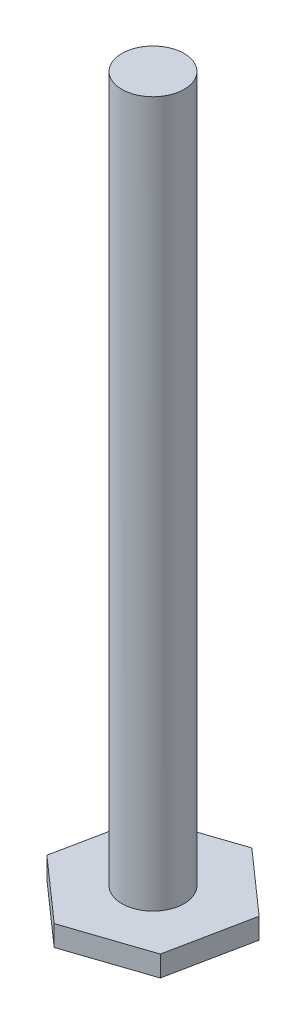
ISO-10303-21;
HEADER;
FILE_DESCRIPTION(('STEP AP214'),'2;1');
FILE_NAME('part.step','',(''),(''),'','','');
FILE_SCHEMA(('AUTOMOTIVE_DESIGN { 1 0 10303 214 1 1 1 1 }'));
ENDSEC;
DATA;
#1=APPLICATION_CONTEXT('core data for automotive mechanical design processes');
#2=APPLICATION_PROTOCOL_DEFINITION('international standard','automotive_design',2000,#1);
#3=PRODUCT_CONTEXT('',#1,'mechanical');
#4=PRODUCT('Part','Part','',(#3));
#5=PRODUCT_RELATED_PRODUCT_CATEGORY('part','',(#4));
#6=PRODUCT_DEFINITION_FORMATION('','',#4);
#7=PRODUCT_DEFINITION_CONTEXT('part definition',#1,'design');
#8=PRODUCT_DEFINITION('design','',#6,#7);
#9=PRODUCT_DEFINITION_SHAPE('','',#8);
#10=(LENGTH_UNIT() NAMED_UNIT(*) SI_UNIT(.MILLI.,.METRE.));
#11=(NAMED_UNIT(*) PLANE_ANGLE_UNIT() SI_UNIT($,.RADIAN.));
#12=(NAMED_UNIT(*) SI_UNIT($,.STERADIAN.) SOLID_ANGLE_UNIT());
#13=UNCERTAINTY_MEASURE_WITH_UNIT(LENGTH_MEASURE(1.E-05),#10,'distance_accuracy_value','');
#14=(GEOMETRIC_REPRESENTATION_CONTEXT(3) GLOBAL_UNCERTAINTY_ASSIGNED_CONTEXT((#13)) GLOBAL_UNIT_ASSIGNED_CONTEXT((#10,
#11,#12)) REPRESENTATION_CONTEXT('',''));
#15=CARTESIAN_POINT('',(0.,0.,0.));
#16=DIRECTION('',(0.,0.,1.));
#17=DIRECTION('',(1.,0.,0.));
#18=AXIS2_PLACEMENT_3D('',#15,#16,#17);
#19=CARTESIAN_POINT('',(0.,35.,0.));
#20=DIRECTION('',(0.,1.,0.));
#21=DIRECTION('',(0.,0.,1.));
#22=AXIS2_PLACEMENT_3D('',#19,#20,#21);
#23=PLANE('',#22);
#24=CARTESIAN_POINT('',(0.,35.,0.));
#25=DIRECTION('',(0.,-1.,0.));
#26=DIRECTION('',(0.,0.,-1.));
#27=AXIS2_PLACEMENT_3D('',#24,#25,#26);
#28=CIRCLE('',#27,1.5);
#29=CARTESIAN_POINT('',(0.,35.,-1.5));
#30=VERTEX_POINT('',#29);
#31=EDGE_CURVE('E44',#30,#30,#28,.T.);
#32=ORIENTED_EDGE('',*,*,#31,.F.);
#33=EDGE_LOOP('',(#32));
#34=FACE_BOUND('',#33,.T.);
#35=ADVANCED_FACE('F36',(#34),#23,.T.);
#36=CARTESIAN_POINT('',(0.,0.,0.));
#37=DIRECTION('',(0.,-1.,0.));
#38=DIRECTION('',(0.,0.,-1.));
#39=AXIS2_PLACEMENT_3D('',#36,#37,#38);
#40=CYLINDRICAL_SURFACE('',#39,1.5);
#41=CARTESIAN_POINT('',(0.,1.,0.));
#42=DIRECTION('',(0.,1.,0.));
#43=DIRECTION('',(0.,0.,1.));
#44=AXIS2_PLACEMENT_3D('',#41,#42,#43);
#45=CIRCLE('',#44,1.5);
#46=CARTESIAN_POINT('',(0.,1.,1.5));
#47=VERTEX_POINT('',#46);
#48=EDGE_CURVE('E11',#47,#47,#45,.F.);
#49=ORIENTED_EDGE('',*,*,#48,.F.);
#50=EDGE_LOOP('',(#49));
#51=FACE_BOUND('',#50,.T.);
#52=ORIENTED_EDGE('',*,*,#31,.T.);
#53=EDGE_LOOP('',(#52));
#54=FACE_BOUND('',#53,.T.);
#55=ADVANCED_FACE('F142',(#51,#54),#40,.T.);
#56=CARTESIAN_POINT('',(3.02872304898075,1.,2.67584940269554));
#57=DIRECTION('',(-0.980062590415269,0.,-0.198689000371217));
#58=DIRECTION('',(-0.198689000371217,0.,0.980062590415269));
#59=AXIS2_PLACEMENT_3D('',#56,#57,#58);
#60=PLANE('',#59);
#61=DIRECTION('',(0.198689000371217,0.,-0.980062590415269));
#62=VECTOR('',#61,1.);
#63=CARTESIAN_POINT('',(3.02872304898075,0.,2.67584940269554));
#64=LINE('',#63,#62);
#65=CARTESIAN_POINT('',(3.02872304898075,0.,2.67584940269554));
#66=VERTEX_POINT('',#65);
#67=CARTESIAN_POINT('',(3.83171508392613,0.,-1.28502640009702));
#68=VERTEX_POINT('',#67);
#69=EDGE_CURVE('E121',#66,#68,#64,.T.);
#70=ORIENTED_EDGE('',*,*,#69,.T.);
#71=DIRECTION('',(0.,-1.,0.));
#72=VECTOR('',#71,1.);
#73=CARTESIAN_POINT('',(3.83171508392613,1.,-1.28502640009702));
#74=LINE('',#73,#72);
#75=CARTESIAN_POINT('',(3.83171508392613,1.,-1.28502640009702));
#76=VERTEX_POINT('',#75);
#77=EDGE_CURVE('E138',#76,#68,#74,.T.);
#78=ORIENTED_EDGE('',*,*,#77,.F.);
#79=DIRECTION('',(0.198689000371217,0.,-0.980062590415269));
#80=VECTOR('',#79,1.);
#81=CARTESIAN_POINT('',(3.02872304898075,1.,2.67584940269554));
#82=LINE('',#81,#80);
#83=CARTESIAN_POINT('',(3.02872304898075,1.,2.67584940269554));
#84=VERTEX_POINT('',#83);
#85=EDGE_CURVE('E131',#84,#76,#82,.T.);
#86=ORIENTED_EDGE('',*,*,#85,.F.);
#87=DIRECTION('',(0.,-1.,0.));
#88=VECTOR('',#87,1.);
#89=CARTESIAN_POINT('',(3.02872304898075,1.,2.67584940269554));
#90=LINE('',#89,#88);
#91=EDGE_CURVE('E117',#84,#66,#90,.T.);
#92=ORIENTED_EDGE('',*,*,#91,.T.);
#93=EDGE_LOOP('',(#70,#78,#86,#92));
#94=FACE_BOUND('',#93,.T.);
#95=ADVANCED_FACE('F148',(#94),#60,.F.);
#96=CARTESIAN_POINT('',(3.83171508392613,1.,-1.28502640009702));
#97=DIRECTION('',(-0.662101016981644,0.,0.749414600412798));
#98=DIRECTION('',(0.749414600412798,0.,0.662101016981644));
#99=AXIS2_PLACEMENT_3D('',#96,#97,#98);
#100=PLANE('',#99);
#101=DIRECTION('',(-0.749414600412798,0.,-0.662101016981644));
#102=VECTOR('',#101,1.);
#103=CARTESIAN_POINT('',(3.83171508392613,0.,-1.28502640009702));
#104=LINE('',#103,#102);
#105=CARTESIAN_POINT('',(0.802992034945378,0.,-3.96087580279256));
#106=VERTEX_POINT('',#105);
#107=EDGE_CURVE('E124',#68,#106,#104,.T.);
#108=ORIENTED_EDGE('',*,*,#107,.T.);
#109=DIRECTION('',(0.,-1.,0.));
#110=VECTOR('',#109,1.);
#111=CARTESIAN_POINT('',(0.802992034945378,1.,-3.96087580279256));
#112=LINE('',#111,#110);
#113=CARTESIAN_POINT('',(0.802992034945378,1.,-3.96087580279256));
#114=VERTEX_POINT('',#113);
#115=EDGE_CURVE('E135',#114,#106,#112,.T.);
#116=ORIENTED_EDGE('',*,*,#115,.F.);
#117=DIRECTION('',(-0.749414600412798,0.,-0.662101016981644));
#118=VECTOR('',#117,1.);
#119=CARTESIAN_POINT('',(3.83171508392613,1.,-1.28502640009702));
#120=LINE('',#119,#118);
#121=EDGE_CURVE('E90',#76,#114,#120,.T.);
#122=ORIENTED_EDGE('',*,*,#121,.F.);
#123=ORIENTED_EDGE('',*,*,#77,.T.);
#124=EDGE_LOOP('',(#108,#116,#122,#123));
#125=FACE_BOUND('',#124,.T.);
#126=ADVANCED_FACE('F153',(#125),#100,.F.);
#127=CARTESIAN_POINT('',(0.802992034945378,1.,-3.96087580279256));
#128=DIRECTION('',(0.317961573433625,0.,0.948103600784014));
#129=DIRECTION('',(0.948103600784014,0.,-0.317961573433625));
#130=AXIS2_PLACEMENT_3D('',#127,#128,#129);
#131=PLANE('',#130);
#132=DIRECTION('',(-0.948103600784014,0.,0.317961573433625));
#133=VECTOR('',#132,1.);
#134=CARTESIAN_POINT('',(0.802992034945378,0.,-3.96087580279256));
#135=LINE('',#134,#133);
#136=CARTESIAN_POINT('',(-3.02872304898075,0.,-2.67584940269554));
#137=VERTEX_POINT('',#136);
#138=EDGE_CURVE('E126',#106,#137,#135,.T.);
#139=ORIENTED_EDGE('',*,*,#138,.T.);
#140=DIRECTION('',(0.,-1.,0.));
#141=VECTOR('',#140,1.);
#142=CARTESIAN_POINT('',(-3.02872304898075,1.,-2.67584940269554));
#143=LINE('',#142,#141);
#144=CARTESIAN_POINT('',(-3.02872304898075,1.,-2.67584940269554));
#145=VERTEX_POINT('',#144);
#146=EDGE_CURVE('E112',#145,#137,#143,.T.);
#147=ORIENTED_EDGE('',*,*,#146,.F.);
#148=DIRECTION('',(-0.948103600784014,0.,0.317961573433625));
#149=VECTOR('',#148,1.);
#150=CARTESIAN_POINT('',(0.802992034945378,1.,-3.96087580279256));
#151=LINE('',#150,#149);
#152=EDGE_CURVE('E103',#114,#145,#151,.T.);
#153=ORIENTED_EDGE('',*,*,#152,.F.);
#154=ORIENTED_EDGE('',*,*,#115,.T.);
#155=EDGE_LOOP('',(#139,#147,#153,#154));
#156=FACE_BOUND('',#155,.T.);
#157=ADVANCED_FACE('F164',(#156),#131,.F.);
#158=CARTESIAN_POINT('',(-3.02872304898075,1.,-2.67584940269554));
#159=DIRECTION('',(0.980062590415269,0.,0.198689000371217));
#160=DIRECTION('',(0.198689000371217,0.,-0.980062590415269));
#161=AXIS2_PLACEMENT_3D('',#158,#159,#160);
#162=PLANE('',#161);
#163=DIRECTION('',(-0.198689000371217,0.,0.980062590415269));
#164=VECTOR('',#163,1.);
#165=CARTESIAN_POINT('',(-3.02872304898075,0.,-2.67584940269554));
#166=LINE('',#165,#164);
#167=CARTESIAN_POINT('',(-3.83171508392613,0.,1.28502640009702));
#168=VERTEX_POINT('',#167);
#169=EDGE_CURVE('E111',#137,#168,#166,.T.);
#170=ORIENTED_EDGE('',*,*,#169,.T.);
#171=DIRECTION('',(0.,-1.,0.));
#172=VECTOR('',#171,1.);
#173=CARTESIAN_POINT('',(-3.83171508392613,1.,1.28502640009702));
#174=LINE('',#173,#172);
#175=CARTESIAN_POINT('',(-3.83171508392613,1.,1.28502640009702));
#176=VERTEX_POINT('',#175);
#177=EDGE_CURVE('E108',#176,#168,#174,.T.);
#178=ORIENTED_EDGE('',*,*,#177,.F.);
#179=DIRECTION('',(-0.198689000371217,0.,0.980062590415269));
#180=VECTOR('',#179,1.);
#181=CARTESIAN_POINT('',(-3.02872304898075,1.,-2.67584940269554));
#182=LINE('',#181,#180);
#183=EDGE_CURVE('E97',#145,#176,#182,.T.);
#184=ORIENTED_EDGE('',*,*,#183,.F.);
#185=ORIENTED_EDGE('',*,*,#146,.T.);
#186=EDGE_LOOP('',(#170,#178,#184,#185));
#187=FACE_BOUND('',#186,.T.);
#188=ADVANCED_FACE('F109',(#187),#162,.F.);
#189=CARTESIAN_POINT('',(-3.83171508392613,1.,1.28502640009702));
#190=DIRECTION('',(0.662101016981644,0.,-0.749414600412797));
#191=DIRECTION('',(-0.749414600412797,0.,-0.662101016981644));
#192=AXIS2_PLACEMENT_3D('',#189,#190,#191);
#193=PLANE('',#192);
#194=DIRECTION('',(0.749414600412798,0.,0.662101016981644));
#195=VECTOR('',#194,1.);
#196=CARTESIAN_POINT('',(-3.83171508392613,0.,1.28502640009702));
#197=LINE('',#196,#195);
#198=CARTESIAN_POINT('',(-0.802992034945379,0.,3.96087580279256));
#199=VERTEX_POINT('',#198);
#200=EDGE_CURVE('E75',#168,#199,#197,.T.);
#201=ORIENTED_EDGE('',*,*,#200,.T.);
#202=DIRECTION('',(0.,-1.,0.));
#203=VECTOR('',#202,1.);
#204=CARTESIAN_POINT('',(-0.802992034945379,1.,3.96087580279256));
#205=LINE('',#204,#203);
#206=CARTESIAN_POINT('',(-0.802992034945379,1.,3.96087580279256));
#207=VERTEX_POINT('',#206);
#208=EDGE_CURVE('E113',#207,#199,#205,.T.);
#209=ORIENTED_EDGE('',*,*,#208,.F.);
#210=DIRECTION('',(0.749414600412798,0.,0.662101016981644));
#211=VECTOR('',#210,1.);
#212=CARTESIAN_POINT('',(-3.83171508392613,1.,1.28502640009702));
#213=LINE('',#212,#211);
#214=EDGE_CURVE('E101',#176,#207,#213,.T.);
#215=ORIENTED_EDGE('',*,*,#214,.F.);
#216=ORIENTED_EDGE('',*,*,#177,.T.);
#217=EDGE_LOOP('',(#201,#209,#215,#216));
#218=FACE_BOUND('',#217,.T.);
#219=ADVANCED_FACE('F115',(#218),#193,.F.);
#220=CARTESIAN_POINT('',(-0.802992034945379,1.,3.96087580279256));
#221=DIRECTION('',(-0.317961573433625,0.,-0.948103600784014));
#222=DIRECTION('',(-0.948103600784015,0.,0.317961573433625));
#223=AXIS2_PLACEMENT_3D('',#220,#221,#222);
#224=PLANE('',#223);
#225=DIRECTION('',(0.948103600784014,0.,-0.317961573433625));
#226=VECTOR('',#225,1.);
#227=CARTESIAN_POINT('',(-0.802992034945379,0.,3.96087580279256));
#228=LINE('',#227,#226);
#229=EDGE_CURVE('E81',#199,#66,#228,.T.);
#230=ORIENTED_EDGE('',*,*,#229,.T.);
#231=ORIENTED_EDGE('',*,*,#91,.F.);
#232=DIRECTION('',(0.948103600784014,0.,-0.317961573433625));
#233=VECTOR('',#232,1.);
#234=CARTESIAN_POINT('',(-0.802992034945379,1.,3.96087580279256));
#235=LINE('',#234,#233);
#236=EDGE_CURVE('E52',#207,#84,#235,.T.);
#237=ORIENTED_EDGE('',*,*,#236,.F.);
#238=ORIENTED_EDGE('',*,*,#208,.T.);
#239=EDGE_LOOP('',(#230,#231,#237,#238));
#240=FACE_BOUND('',#239,.T.);
#241=ADVANCED_FACE('F172',(#240),#224,.F.);
#242=CARTESIAN_POINT('',(0.,1.,0.));
#243=DIRECTION('',(0.,1.,0.));
#244=DIRECTION('',(0.,0.,1.));
#245=AXIS2_PLACEMENT_3D('',#242,#243,#244);
#246=PLANE('',#245);
#247=ORIENTED_EDGE('',*,*,#48,.T.);
#248=EDGE_LOOP('',(#247));
#249=FACE_BOUND('',#248,.T.);
#250=ORIENTED_EDGE('',*,*,#85,.T.);
#251=ORIENTED_EDGE('',*,*,#121,.T.);
#252=ORIENTED_EDGE('',*,*,#152,.T.);
#253=ORIENTED_EDGE('',*,*,#183,.T.);
#254=ORIENTED_EDGE('',*,*,#214,.T.);
#255=ORIENTED_EDGE('',*,*,#236,.T.);
#256=EDGE_LOOP('',(#250,#251,#252,#253,#254,#255));
#257=FACE_BOUND('',#256,.T.);
#258=ADVANCED_FACE('F99',(#249,#257),#246,.T.);
#259=CARTESIAN_POINT('',(1.5,0.,0.));
#260=DIRECTION('',(0.,-1.,0.));
#261=DIRECTION('',(0.,0.,-1.));
#262=AXIS2_PLACEMENT_3D('',#259,#260,#261);
#263=PLANE('',#262);
#264=ORIENTED_EDGE('',*,*,#69,.F.);
#265=ORIENTED_EDGE('',*,*,#229,.F.);
#266=ORIENTED_EDGE('',*,*,#200,.F.);
#267=ORIENTED_EDGE('',*,*,#169,.F.);
#268=ORIENTED_EDGE('',*,*,#138,.F.);
#269=ORIENTED_EDGE('',*,*,#107,.F.);
#270=EDGE_LOOP('',(#264,#265,#266,#267,#268,#269));
#271=FACE_BOUND('',#270,.T.);
#272=ADVANCED_FACE('F158',(#271),#263,.T.);
#273=CLOSED_SHELL('',(#35,#55,#95,#126,#157,#188,#219,#241,#258,#272));
#274=MANIFOLD_SOLID_BREP('B2',#273);
#275=ADVANCED_BREP_SHAPE_REPRESENTATION('',(#18,#274),#14);
#276=SHAPE_DEFINITION_REPRESENTATION(#9,#275);
ENDSEC;
END-ISO-10303-21;
